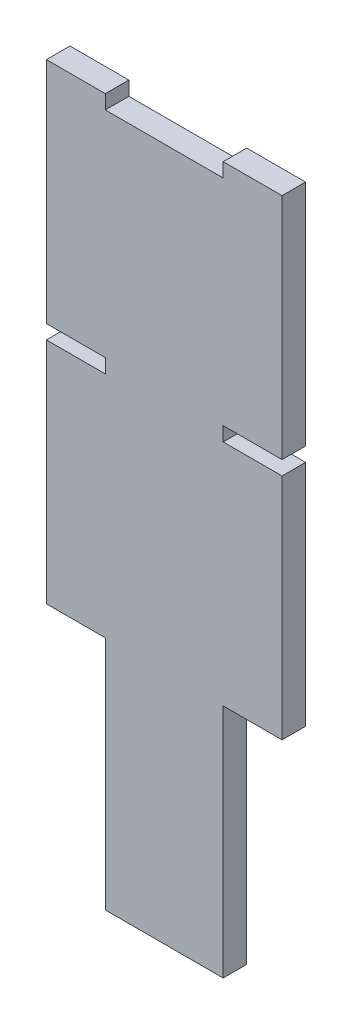
ISO-10303-21;
HEADER;
FILE_DESCRIPTION(('STEP AP214'),'2;1');
FILE_NAME('part.step','',(''),(''),'','','');
FILE_SCHEMA(('AUTOMOTIVE_DESIGN { 1 0 10303 214 1 1 1 1 }'));
ENDSEC;
DATA;
#1=APPLICATION_CONTEXT('core data for automotive mechanical design processes');
#2=APPLICATION_PROTOCOL_DEFINITION('international standard','automotive_design',2000,#1);
#3=PRODUCT_CONTEXT('',#1,'mechanical');
#4=PRODUCT('Part','Part','',(#3));
#5=PRODUCT_RELATED_PRODUCT_CATEGORY('part','',(#4));
#6=PRODUCT_DEFINITION_FORMATION('','',#4);
#7=PRODUCT_DEFINITION_CONTEXT('part definition',#1,'design');
#8=PRODUCT_DEFINITION('design','',#6,#7);
#9=PRODUCT_DEFINITION_SHAPE('','',#8);
#10=(LENGTH_UNIT() NAMED_UNIT(*) SI_UNIT(.MILLI.,.METRE.));
#11=(NAMED_UNIT(*) PLANE_ANGLE_UNIT() SI_UNIT($,.RADIAN.));
#12=(NAMED_UNIT(*) SI_UNIT($,.STERADIAN.) SOLID_ANGLE_UNIT());
#13=UNCERTAINTY_MEASURE_WITH_UNIT(LENGTH_MEASURE(1.E-05),#10,'distance_accuracy_value','');
#14=(GEOMETRIC_REPRESENTATION_CONTEXT(3) GLOBAL_UNCERTAINTY_ASSIGNED_CONTEXT((#13)) GLOBAL_UNIT_ASSIGNED_CONTEXT((#10,
#11,#12)) REPRESENTATION_CONTEXT('',''));
#15=CARTESIAN_POINT('',(0.,0.,0.));
#16=DIRECTION('',(0.,0.,1.));
#17=DIRECTION('',(1.,0.,0.));
#18=AXIS2_PLACEMENT_3D('',#15,#16,#17);
#19=CARTESIAN_POINT('',(25.,75.,5.));
#20=DIRECTION('',(-1.,0.,0.));
#21=DIRECTION('',(0.,-1.,0.));
#22=AXIS2_PLACEMENT_3D('',#19,#20,#21);
#23=PLANE('',#22);
#24=DIRECTION('',(0.,1.,0.));
#25=VECTOR('',#24,1.);
#26=CARTESIAN_POINT('',(25.,75.,5.));
#27=LINE('',#26,#25);
#28=CARTESIAN_POINT('',(25.,26.5,5.));
#29=VERTEX_POINT('',#28);
#30=CARTESIAN_POINT('',(25.,75.,5.));
#31=VERTEX_POINT('',#30);
#32=EDGE_CURVE('E207',#29,#31,#27,.T.);
#33=ORIENTED_EDGE('',*,*,#32,.F.);
#34=DIRECTION('',(0.,0.,1.));
#35=VECTOR('',#34,1.);
#36=CARTESIAN_POINT('',(25.,26.5,0.));
#37=LINE('',#36,#35);
#38=CARTESIAN_POINT('',(25.,26.5,0.));
#39=VERTEX_POINT('',#38);
#40=EDGE_CURVE('E274',#39,#29,#37,.T.);
#41=ORIENTED_EDGE('',*,*,#40,.F.);
#42=DIRECTION('',(0.,1.,0.));
#43=VECTOR('',#42,1.);
#44=CARTESIAN_POINT('',(25.,75.,0.));
#45=LINE('',#44,#43);
#46=CARTESIAN_POINT('',(25.,75.,0.));
#47=VERTEX_POINT('',#46);
#48=EDGE_CURVE('E201',#39,#47,#45,.T.);
#49=ORIENTED_EDGE('',*,*,#48,.T.);
#50=DIRECTION('',(0.,0.,-1.));
#51=VECTOR('',#50,1.);
#52=CARTESIAN_POINT('',(25.,75.,5.));
#53=LINE('',#52,#51);
#54=EDGE_CURVE('E11',#31,#47,#53,.T.);
#55=ORIENTED_EDGE('',*,*,#54,.F.);
#56=EDGE_LOOP('',(#33,#41,#49,#55));
#57=FACE_BOUND('',#56,.T.);
#58=ADVANCED_FACE('F33',(#57),#23,.F.);
#59=CARTESIAN_POINT('',(-25.,75.,5.));
#60=DIRECTION('',(0.,-1.,0.));
#61=DIRECTION('',(0.,0.,-1.));
#62=AXIS2_PLACEMENT_3D('',#59,#60,#61);
#63=PLANE('',#62);
#64=DIRECTION('',(-1.,0.,0.));
#65=VECTOR('',#64,1.);
#66=CARTESIAN_POINT('',(-25.,75.,0.));
#67=LINE('',#66,#65);
#68=CARTESIAN_POINT('',(12.5,75.,0.));
#69=VERTEX_POINT('',#68);
#70=EDGE_CURVE('E186',#47,#69,#67,.T.);
#71=ORIENTED_EDGE('',*,*,#70,.T.);
#72=DIRECTION('',(0.,0.,1.));
#73=VECTOR('',#72,1.);
#74=CARTESIAN_POINT('',(12.5,75.,0.));
#75=LINE('',#74,#73);
#76=CARTESIAN_POINT('',(12.5,75.,5.));
#77=VERTEX_POINT('',#76);
#78=EDGE_CURVE('E170',#69,#77,#75,.T.);
#79=ORIENTED_EDGE('',*,*,#78,.T.);
#80=DIRECTION('',(-1.,0.,0.));
#81=VECTOR('',#80,1.);
#82=CARTESIAN_POINT('',(-25.,75.,5.));
#83=LINE('',#82,#81);
#84=EDGE_CURVE('E224',#31,#77,#83,.T.);
#85=ORIENTED_EDGE('',*,*,#84,.F.);
#86=ORIENTED_EDGE('',*,*,#54,.T.);
#87=EDGE_LOOP('',(#71,#79,#85,#86));
#88=FACE_BOUND('',#87,.T.);
#89=ADVANCED_FACE('F191',(#88),#63,.F.);
#90=CARTESIAN_POINT('',(-25.,75.,5.));
#91=DIRECTION('',(1.,0.,0.));
#92=DIRECTION('',(0.,1.,0.));
#93=AXIS2_PLACEMENT_3D('',#90,#91,#92);
#94=PLANE('',#93);
#95=DIRECTION('',(0.,-1.,0.));
#96=VECTOR('',#95,1.);
#97=CARTESIAN_POINT('',(-25.,75.,0.));
#98=LINE('',#97,#96);
#99=CARTESIAN_POINT('',(-25.,75.,0.));
#100=VERTEX_POINT('',#99);
#101=CARTESIAN_POINT('',(-25.,26.5,0.));
#102=VERTEX_POINT('',#101);
#103=EDGE_CURVE('E197',#100,#102,#98,.T.);
#104=ORIENTED_EDGE('',*,*,#103,.T.);
#105=DIRECTION('',(0.,0.,1.));
#106=VECTOR('',#105,1.);
#107=CARTESIAN_POINT('',(-25.,26.5,0.));
#108=LINE('',#107,#106);
#109=CARTESIAN_POINT('',(-25.,26.5,5.));
#110=VERTEX_POINT('',#109);
#111=EDGE_CURVE('E299',#102,#110,#108,.T.);
#112=ORIENTED_EDGE('',*,*,#111,.T.);
#113=DIRECTION('',(0.,-1.,0.));
#114=VECTOR('',#113,1.);
#115=CARTESIAN_POINT('',(-25.,75.,5.));
#116=LINE('',#115,#114);
#117=CARTESIAN_POINT('',(-25.,75.,5.));
#118=VERTEX_POINT('',#117);
#119=EDGE_CURVE('E215',#118,#110,#116,.T.);
#120=ORIENTED_EDGE('',*,*,#119,.F.);
#121=DIRECTION('',(0.,0.,-1.));
#122=VECTOR('',#121,1.);
#123=CARTESIAN_POINT('',(-25.,75.,5.));
#124=LINE('',#123,#122);
#125=EDGE_CURVE('E41',#118,#100,#124,.T.);
#126=ORIENTED_EDGE('',*,*,#125,.T.);
#127=EDGE_LOOP('',(#104,#112,#120,#126));
#128=FACE_BOUND('',#127,.T.);
#129=ADVANCED_FACE('F374',(#128),#94,.F.);
#130=CARTESIAN_POINT('',(25.0000000000028,-25.,0.));
#131=VERTEX_POINT('',#130);
#132=CARTESIAN_POINT('',(25.,23.5,0.));
#133=VERTEX_POINT('',#132);
#134=EDGE_CURVE('E199',#131,#133,#45,.T.);
#135=ORIENTED_EDGE('',*,*,#134,.T.);
#136=DIRECTION('',(0.,0.,1.));
#137=VECTOR('',#136,1.);
#138=CARTESIAN_POINT('',(25.,23.5,0.));
#139=LINE('',#138,#137);
#140=CARTESIAN_POINT('',(25.,23.5,5.));
#141=VERTEX_POINT('',#140);
#142=EDGE_CURVE('E271',#133,#141,#139,.T.);
#143=ORIENTED_EDGE('',*,*,#142,.T.);
#144=CARTESIAN_POINT('',(25.0000000000028,-25.,5.));
#145=VERTEX_POINT('',#144);
#146=EDGE_CURVE('E228',#145,#141,#27,.T.);
#147=ORIENTED_EDGE('',*,*,#146,.F.);
#148=DIRECTION('',(0.,0.,1.));
#149=VECTOR('',#148,1.);
#150=CARTESIAN_POINT('',(25.0000000000028,-25.,0.));
#151=LINE('',#150,#149);
#152=EDGE_CURVE('E229',#131,#145,#151,.T.);
#153=ORIENTED_EDGE('',*,*,#152,.F.);
#154=EDGE_LOOP('',(#135,#143,#147,#153));
#155=FACE_BOUND('',#154,.T.);
#156=ADVANCED_FACE('F35',(#155),#23,.F.);
#157=CARTESIAN_POINT('',(-12.5,75.,5.));
#158=VERTEX_POINT('',#157);
#159=EDGE_CURVE('E226',#158,#118,#83,.T.);
#160=ORIENTED_EDGE('',*,*,#159,.F.);
#161=DIRECTION('',(0.,0.,1.));
#162=VECTOR('',#161,1.);
#163=CARTESIAN_POINT('',(-12.5,75.,0.));
#164=LINE('',#163,#162);
#165=CARTESIAN_POINT('',(-12.5,75.,0.));
#166=VERTEX_POINT('',#165);
#167=EDGE_CURVE('E180',#166,#158,#164,.T.);
#168=ORIENTED_EDGE('',*,*,#167,.F.);
#169=EDGE_CURVE('E194',#166,#100,#67,.T.);
#170=ORIENTED_EDGE('',*,*,#169,.T.);
#171=ORIENTED_EDGE('',*,*,#125,.F.);
#172=EDGE_LOOP('',(#160,#168,#170,#171));
#173=FACE_BOUND('',#172,.T.);
#174=ADVANCED_FACE('F334',(#173),#63,.F.);
#175=CARTESIAN_POINT('',(-25.,23.5,5.));
#176=VERTEX_POINT('',#175);
#177=CARTESIAN_POINT('',(-25.0000000000028,-25.,5.));
#178=VERTEX_POINT('',#177);
#179=EDGE_CURVE('E221',#176,#178,#116,.T.);
#180=ORIENTED_EDGE('',*,*,#179,.F.);
#181=DIRECTION('',(0.,0.,1.));
#182=VECTOR('',#181,1.);
#183=CARTESIAN_POINT('',(-25.,23.5,0.));
#184=LINE('',#183,#182);
#185=CARTESIAN_POINT('',(-25.,23.5,0.));
#186=VERTEX_POINT('',#185);
#187=EDGE_CURVE('E292',#186,#176,#184,.T.);
#188=ORIENTED_EDGE('',*,*,#187,.F.);
#189=CARTESIAN_POINT('',(-25.0000000000028,-25.,0.));
#190=VERTEX_POINT('',#189);
#191=EDGE_CURVE('E193',#186,#190,#98,.T.);
#192=ORIENTED_EDGE('',*,*,#191,.T.);
#193=DIRECTION('',(0.,0.,1.));
#194=VECTOR('',#193,1.);
#195=CARTESIAN_POINT('',(-25.0000000000028,-25.,0.));
#196=LINE('',#195,#194);
#197=EDGE_CURVE('E253',#190,#178,#196,.T.);
#198=ORIENTED_EDGE('',*,*,#197,.T.);
#199=EDGE_LOOP('',(#180,#188,#192,#198));
#200=FACE_BOUND('',#199,.T.);
#201=ADVANCED_FACE('F380',(#200),#94,.F.);
#202=CARTESIAN_POINT('',(-25.,-75.,5.));
#203=DIRECTION('',(0.,1.,0.));
#204=DIRECTION('',(0.,0.,1.));
#205=AXIS2_PLACEMENT_3D('',#202,#203,#204);
#206=PLANE('',#205);
#207=DIRECTION('',(1.,0.,0.));
#208=VECTOR('',#207,1.);
#209=CARTESIAN_POINT('',(-25.,-75.,5.));
#210=LINE('',#209,#208);
#211=CARTESIAN_POINT('',(-12.5,-75.,5.));
#212=VERTEX_POINT('',#211);
#213=CARTESIAN_POINT('',(12.5,-75.,5.));
#214=VERTEX_POINT('',#213);
#215=EDGE_CURVE('E209',#212,#214,#210,.T.);
#216=ORIENTED_EDGE('',*,*,#215,.F.);
#217=DIRECTION('',(0.,0.,1.));
#218=VECTOR('',#217,1.);
#219=CARTESIAN_POINT('',(-12.5,-75.,0.));
#220=LINE('',#219,#218);
#221=CARTESIAN_POINT('',(-12.5,-75.,0.));
#222=VERTEX_POINT('',#221);
#223=EDGE_CURVE('E248',#222,#212,#220,.T.);
#224=ORIENTED_EDGE('',*,*,#223,.F.);
#225=DIRECTION('',(1.,0.,0.));
#226=VECTOR('',#225,1.);
#227=CARTESIAN_POINT('',(-25.,-75.,0.));
#228=LINE('',#227,#226);
#229=CARTESIAN_POINT('',(12.5,-75.,0.));
#230=VERTEX_POINT('',#229);
#231=EDGE_CURVE('E205',#222,#230,#228,.T.);
#232=ORIENTED_EDGE('',*,*,#231,.T.);
#233=DIRECTION('',(0.,0.,1.));
#234=VECTOR('',#233,1.);
#235=CARTESIAN_POINT('',(12.5,-75.,0.));
#236=LINE('',#235,#234);
#237=EDGE_CURVE('E234',#230,#214,#236,.T.);
#238=ORIENTED_EDGE('',*,*,#237,.T.);
#239=EDGE_LOOP('',(#216,#224,#232,#238));
#240=FACE_BOUND('',#239,.T.);
#241=ADVANCED_FACE('F386',(#240),#206,.F.);
#242=CARTESIAN_POINT('',(0.,0.,5.));
#243=DIRECTION('',(0.,0.,1.));
#244=DIRECTION('',(1.,0.,0.));
#245=AXIS2_PLACEMENT_3D('',#242,#243,#244);
#246=PLANE('',#245);
#247=DIRECTION('',(0.,1.,0.));
#248=VECTOR('',#247,1.);
#249=CARTESIAN_POINT('',(12.5,75.,5.));
#250=LINE('',#249,#248);
#251=CARTESIAN_POINT('',(12.5,72.,5.));
#252=VERTEX_POINT('',#251);
#253=EDGE_CURVE('E175',#252,#77,#250,.T.);
#254=ORIENTED_EDGE('',*,*,#253,.F.);
#255=DIRECTION('',(1.,0.,0.));
#256=VECTOR('',#255,1.);
#257=CARTESIAN_POINT('',(-12.5,72.,5.));
#258=LINE('',#257,#256);
#259=CARTESIAN_POINT('',(-12.5,72.,5.));
#260=VERTEX_POINT('',#259);
#261=EDGE_CURVE('E189',#260,#252,#258,.T.);
#262=ORIENTED_EDGE('',*,*,#261,.F.);
#263=DIRECTION('',(0.,-1.,0.));
#264=VECTOR('',#263,1.);
#265=CARTESIAN_POINT('',(-12.5,75.,5.));
#266=LINE('',#265,#264);
#267=EDGE_CURVE('E322',#158,#260,#266,.T.);
#268=ORIENTED_EDGE('',*,*,#267,.F.);
#269=ORIENTED_EDGE('',*,*,#159,.T.);
#270=ORIENTED_EDGE('',*,*,#119,.T.);
#271=DIRECTION('',(-1.,0.,0.));
#272=VECTOR('',#271,1.);
#273=CARTESIAN_POINT('',(-25.,26.5,5.));
#274=LINE('',#273,#272);
#275=CARTESIAN_POINT('',(-12.5,26.5,5.));
#276=VERTEX_POINT('',#275);
#277=EDGE_CURVE('E302',#276,#110,#274,.T.);
#278=ORIENTED_EDGE('',*,*,#277,.F.);
#279=DIRECTION('',(0.,1.,0.));
#280=VECTOR('',#279,1.);
#281=CARTESIAN_POINT('',(-12.5,26.5,5.));
#282=LINE('',#281,#280);
#283=CARTESIAN_POINT('',(-12.5,23.5,5.));
#284=VERTEX_POINT('',#283);
#285=EDGE_CURVE('E305',#284,#276,#282,.T.);
#286=ORIENTED_EDGE('',*,*,#285,.F.);
#287=DIRECTION('',(1.,0.,0.));
#288=VECTOR('',#287,1.);
#289=CARTESIAN_POINT('',(-25.,23.5,5.));
#290=LINE('',#289,#288);
#291=EDGE_CURVE('E276',#176,#284,#290,.T.);
#292=ORIENTED_EDGE('',*,*,#291,.F.);
#293=ORIENTED_EDGE('',*,*,#179,.T.);
#294=DIRECTION('',(-1.,0.,0.));
#295=VECTOR('',#294,1.);
#296=CARTESIAN_POINT('',(-25.0000000000028,-25.,5.));
#297=LINE('',#296,#295);
#298=CARTESIAN_POINT('',(-12.5,-25.,5.));
#299=VERTEX_POINT('',#298);
#300=EDGE_CURVE('E257',#299,#178,#297,.T.);
#301=ORIENTED_EDGE('',*,*,#300,.F.);
#302=DIRECTION('',(0.,1.,0.));
#303=VECTOR('',#302,1.);
#304=CARTESIAN_POINT('',(-12.5,-25.,5.));
#305=LINE('',#304,#303);
#306=EDGE_CURVE('E237',#212,#299,#305,.T.);
#307=ORIENTED_EDGE('',*,*,#306,.F.);
#308=ORIENTED_EDGE('',*,*,#215,.T.);
#309=DIRECTION('',(0.,-1.,0.));
#310=VECTOR('',#309,1.);
#311=CARTESIAN_POINT('',(12.5,-25.,5.));
#312=LINE('',#311,#310);
#313=CARTESIAN_POINT('',(12.5,-25.,5.));
#314=VERTEX_POINT('',#313);
#315=EDGE_CURVE('E238',#314,#214,#312,.T.);
#316=ORIENTED_EDGE('',*,*,#315,.F.);
#317=DIRECTION('',(-1.,0.,0.));
#318=VECTOR('',#317,1.);
#319=CARTESIAN_POINT('',(25.0000000000028,-25.,5.));
#320=LINE('',#319,#318);
#321=EDGE_CURVE('E241',#145,#314,#320,.T.);
#322=ORIENTED_EDGE('',*,*,#321,.F.);
#323=ORIENTED_EDGE('',*,*,#146,.T.);
#324=DIRECTION('',(1.,0.,0.));
#325=VECTOR('',#324,1.);
#326=CARTESIAN_POINT('',(25.,23.5,5.));
#327=LINE('',#326,#325);
#328=CARTESIAN_POINT('',(12.5,23.5,5.));
#329=VERTEX_POINT('',#328);
#330=EDGE_CURVE('E277',#329,#141,#327,.T.);
#331=ORIENTED_EDGE('',*,*,#330,.F.);
#332=DIRECTION('',(0.,-1.,0.));
#333=VECTOR('',#332,1.);
#334=CARTESIAN_POINT('',(12.5,26.5,5.));
#335=LINE('',#334,#333);
#336=CARTESIAN_POINT('',(12.5,26.5,5.));
#337=VERTEX_POINT('',#336);
#338=EDGE_CURVE('E280',#337,#329,#335,.T.);
#339=ORIENTED_EDGE('',*,*,#338,.F.);
#340=DIRECTION('',(-1.,0.,0.));
#341=VECTOR('',#340,1.);
#342=CARTESIAN_POINT('',(25.,26.5,5.));
#343=LINE('',#342,#341);
#344=EDGE_CURVE('E256',#29,#337,#343,.T.);
#345=ORIENTED_EDGE('',*,*,#344,.F.);
#346=ORIENTED_EDGE('',*,*,#32,.T.);
#347=ORIENTED_EDGE('',*,*,#84,.T.);
#348=EDGE_LOOP('',(#254,#262,#268,#269,#270,#278,#286,#292,#293,#301,#307,#308,#316,#322,#323,
#331,#339,#345,#346,#347));
#349=FACE_BOUND('',#348,.T.);
#350=ADVANCED_FACE('F339',(#349),#246,.T.);
#351=CARTESIAN_POINT('',(0.,0.,0.));
#352=DIRECTION('',(0.,0.,1.));
#353=DIRECTION('',(1.,0.,0.));
#354=AXIS2_PLACEMENT_3D('',#351,#352,#353);
#355=PLANE('',#354);
#356=DIRECTION('',(1.,0.,0.));
#357=VECTOR('',#356,1.);
#358=CARTESIAN_POINT('',(-12.5,72.,0.));
#359=LINE('',#358,#357);
#360=CARTESIAN_POINT('',(-12.5,72.,0.));
#361=VERTEX_POINT('',#360);
#362=CARTESIAN_POINT('',(12.5,72.,0.));
#363=VERTEX_POINT('',#362);
#364=EDGE_CURVE('E48',#361,#363,#359,.T.);
#365=ORIENTED_EDGE('',*,*,#364,.T.);
#366=DIRECTION('',(0.,1.,0.));
#367=VECTOR('',#366,1.);
#368=CARTESIAN_POINT('',(12.5,75.,0.));
#369=LINE('',#368,#367);
#370=EDGE_CURVE('E173',#363,#69,#369,.T.);
#371=ORIENTED_EDGE('',*,*,#370,.T.);
#372=ORIENTED_EDGE('',*,*,#70,.F.);
#373=ORIENTED_EDGE('',*,*,#48,.F.);
#374=DIRECTION('',(-1.,0.,0.));
#375=VECTOR('',#374,1.);
#376=CARTESIAN_POINT('',(25.,26.5,0.));
#377=LINE('',#376,#375);
#378=CARTESIAN_POINT('',(12.5,26.5,0.));
#379=VERTEX_POINT('',#378);
#380=EDGE_CURVE('E279',#39,#379,#377,.T.);
#381=ORIENTED_EDGE('',*,*,#380,.T.);
#382=DIRECTION('',(0.,-1.,0.));
#383=VECTOR('',#382,1.);
#384=CARTESIAN_POINT('',(12.5,26.5,0.));
#385=LINE('',#384,#383);
#386=CARTESIAN_POINT('',(12.5,23.5,0.));
#387=VERTEX_POINT('',#386);
#388=EDGE_CURVE('E287',#379,#387,#385,.T.);
#389=ORIENTED_EDGE('',*,*,#388,.T.);
#390=DIRECTION('',(1.,0.,0.));
#391=VECTOR('',#390,1.);
#392=CARTESIAN_POINT('',(25.,23.5,0.));
#393=LINE('',#392,#391);
#394=EDGE_CURVE('E269',#387,#133,#393,.T.);
#395=ORIENTED_EDGE('',*,*,#394,.T.);
#396=ORIENTED_EDGE('',*,*,#134,.F.);
#397=DIRECTION('',(-1.,0.,0.));
#398=VECTOR('',#397,1.);
#399=CARTESIAN_POINT('',(25.0000000000028,-25.,0.));
#400=LINE('',#399,#398);
#401=CARTESIAN_POINT('',(12.5,-25.,0.));
#402=VERTEX_POINT('',#401);
#403=EDGE_CURVE('E240',#131,#402,#400,.T.);
#404=ORIENTED_EDGE('',*,*,#403,.T.);
#405=DIRECTION('',(0.,-1.,0.));
#406=VECTOR('',#405,1.);
#407=CARTESIAN_POINT('',(12.5,-25.,0.));
#408=LINE('',#407,#406);
#409=EDGE_CURVE('E232',#402,#230,#408,.T.);
#410=ORIENTED_EDGE('',*,*,#409,.T.);
#411=ORIENTED_EDGE('',*,*,#231,.F.);
#412=DIRECTION('',(0.,1.,0.));
#413=VECTOR('',#412,1.);
#414=CARTESIAN_POINT('',(-12.5,-25.,0.));
#415=LINE('',#414,#413);
#416=CARTESIAN_POINT('',(-12.5,-25.,0.));
#417=VERTEX_POINT('',#416);
#418=EDGE_CURVE('E259',#222,#417,#415,.T.);
#419=ORIENTED_EDGE('',*,*,#418,.T.);
#420=DIRECTION('',(-1.,0.,0.));
#421=VECTOR('',#420,1.);
#422=CARTESIAN_POINT('',(-25.0000000000028,-25.,0.));
#423=LINE('',#422,#421);
#424=EDGE_CURVE('E251',#417,#190,#423,.T.);
#425=ORIENTED_EDGE('',*,*,#424,.T.);
#426=ORIENTED_EDGE('',*,*,#191,.F.);
#427=DIRECTION('',(1.,0.,0.));
#428=VECTOR('',#427,1.);
#429=CARTESIAN_POINT('',(-25.,23.5,0.));
#430=LINE('',#429,#428);
#431=CARTESIAN_POINT('',(-12.5,23.5,0.));
#432=VERTEX_POINT('',#431);
#433=EDGE_CURVE('E304',#186,#432,#430,.T.);
#434=ORIENTED_EDGE('',*,*,#433,.T.);
#435=DIRECTION('',(0.,1.,0.));
#436=VECTOR('',#435,1.);
#437=CARTESIAN_POINT('',(-12.5,26.5,0.));
#438=LINE('',#437,#436);
#439=CARTESIAN_POINT('',(-12.5,26.5,0.));
#440=VERTEX_POINT('',#439);
#441=EDGE_CURVE('E56',#432,#440,#438,.T.);
#442=ORIENTED_EDGE('',*,*,#441,.T.);
#443=DIRECTION('',(-1.,0.,0.));
#444=VECTOR('',#443,1.);
#445=CARTESIAN_POINT('',(-25.,26.5,0.));
#446=LINE('',#445,#444);
#447=EDGE_CURVE('E295',#440,#102,#446,.T.);
#448=ORIENTED_EDGE('',*,*,#447,.T.);
#449=ORIENTED_EDGE('',*,*,#103,.F.);
#450=ORIENTED_EDGE('',*,*,#169,.F.);
#451=DIRECTION('',(0.,-1.,0.));
#452=VECTOR('',#451,1.);
#453=CARTESIAN_POINT('',(-12.5,75.,0.));
#454=LINE('',#453,#452);
#455=EDGE_CURVE('E188',#166,#361,#454,.T.);
#456=ORIENTED_EDGE('',*,*,#455,.T.);
#457=EDGE_LOOP('',(#365,#371,#372,#373,#381,#389,#395,#396,#404,#410,#411,#419,#425,#426,#434,
#442,#448,#449,#450,#456));
#458=FACE_BOUND('',#457,.T.);
#459=ADVANCED_FACE('F184',(#458),#355,.F.);
#460=CARTESIAN_POINT('',(12.5,-25.,0.));
#461=DIRECTION('',(-1.,0.,0.));
#462=DIRECTION('',(0.,-1.,0.));
#463=AXIS2_PLACEMENT_3D('',#460,#461,#462);
#464=PLANE('',#463);
#465=ORIENTED_EDGE('',*,*,#315,.T.);
#466=ORIENTED_EDGE('',*,*,#237,.F.);
#467=ORIENTED_EDGE('',*,*,#409,.F.);
#468=DIRECTION('',(0.,0.,1.));
#469=VECTOR('',#468,1.);
#470=CARTESIAN_POINT('',(12.5,-25.,0.));
#471=LINE('',#470,#469);
#472=EDGE_CURVE('E231',#402,#314,#471,.T.);
#473=ORIENTED_EDGE('',*,*,#472,.T.);
#474=EDGE_LOOP('',(#465,#466,#467,#473));
#475=FACE_BOUND('',#474,.T.);
#476=ADVANCED_FACE('F407',(#475),#464,.F.);
#477=CARTESIAN_POINT('',(25.0000000000028,-25.,0.));
#478=DIRECTION('',(0.,1.,0.));
#479=DIRECTION('',(0.,0.,1.));
#480=AXIS2_PLACEMENT_3D('',#477,#478,#479);
#481=PLANE('',#480);
#482=ORIENTED_EDGE('',*,*,#321,.T.);
#483=ORIENTED_EDGE('',*,*,#472,.F.);
#484=ORIENTED_EDGE('',*,*,#403,.F.);
#485=ORIENTED_EDGE('',*,*,#152,.T.);
#486=EDGE_LOOP('',(#482,#483,#484,#485));
#487=FACE_BOUND('',#486,.T.);
#488=ADVANCED_FACE('F410',(#487),#481,.F.);
#489=CARTESIAN_POINT('',(-25.0000000000028,-25.,0.));
#490=DIRECTION('',(0.,1.,0.));
#491=DIRECTION('',(0.,0.,1.));
#492=AXIS2_PLACEMENT_3D('',#489,#490,#491);
#493=PLANE('',#492);
#494=ORIENTED_EDGE('',*,*,#300,.T.);
#495=ORIENTED_EDGE('',*,*,#197,.F.);
#496=ORIENTED_EDGE('',*,*,#424,.F.);
#497=DIRECTION('',(0.,0.,1.));
#498=VECTOR('',#497,1.);
#499=CARTESIAN_POINT('',(-12.5,-25.,0.));
#500=LINE('',#499,#498);
#501=EDGE_CURVE('E250',#417,#299,#500,.T.);
#502=ORIENTED_EDGE('',*,*,#501,.T.);
#503=EDGE_LOOP('',(#494,#495,#496,#502));
#504=FACE_BOUND('',#503,.T.);
#505=ADVANCED_FACE('F365',(#504),#493,.F.);
#506=CARTESIAN_POINT('',(-12.5,-25.,0.));
#507=DIRECTION('',(1.,0.,0.));
#508=DIRECTION('',(0.,1.,0.));
#509=AXIS2_PLACEMENT_3D('',#506,#507,#508);
#510=PLANE('',#509);
#511=ORIENTED_EDGE('',*,*,#306,.T.);
#512=ORIENTED_EDGE('',*,*,#501,.F.);
#513=ORIENTED_EDGE('',*,*,#418,.F.);
#514=ORIENTED_EDGE('',*,*,#223,.T.);
#515=EDGE_LOOP('',(#511,#512,#513,#514));
#516=FACE_BOUND('',#515,.T.);
#517=ADVANCED_FACE('F358',(#516),#510,.F.);
#518=CARTESIAN_POINT('',(25.,26.5,0.));
#519=DIRECTION('',(0.,1.,0.));
#520=DIRECTION('',(0.,0.,1.));
#521=AXIS2_PLACEMENT_3D('',#518,#519,#520);
#522=PLANE('',#521);
#523=ORIENTED_EDGE('',*,*,#344,.T.);
#524=DIRECTION('',(0.,0.,1.));
#525=VECTOR('',#524,1.);
#526=CARTESIAN_POINT('',(12.5,26.5,0.));
#527=LINE('',#526,#525);
#528=EDGE_CURVE('E266',#379,#337,#527,.T.);
#529=ORIENTED_EDGE('',*,*,#528,.F.);
#530=ORIENTED_EDGE('',*,*,#380,.F.);
#531=ORIENTED_EDGE('',*,*,#40,.T.);
#532=EDGE_LOOP('',(#523,#529,#530,#531));
#533=FACE_BOUND('',#532,.T.);
#534=ADVANCED_FACE('F356',(#533),#522,.F.);
#535=CARTESIAN_POINT('',(25.,23.5,0.));
#536=DIRECTION('',(0.,-1.,0.));
#537=DIRECTION('',(0.,0.,-1.));
#538=AXIS2_PLACEMENT_3D('',#535,#536,#537);
#539=PLANE('',#538);
#540=ORIENTED_EDGE('',*,*,#330,.T.);
#541=ORIENTED_EDGE('',*,*,#142,.F.);
#542=ORIENTED_EDGE('',*,*,#394,.F.);
#543=DIRECTION('',(0.,0.,1.));
#544=VECTOR('',#543,1.);
#545=CARTESIAN_POINT('',(12.5,23.5,0.));
#546=LINE('',#545,#544);
#547=EDGE_CURVE('E268',#387,#329,#546,.T.);
#548=ORIENTED_EDGE('',*,*,#547,.T.);
#549=EDGE_LOOP('',(#540,#541,#542,#548));
#550=FACE_BOUND('',#549,.T.);
#551=ADVANCED_FACE('F346',(#550),#539,.F.);
#552=CARTESIAN_POINT('',(12.5,26.5,0.));
#553=DIRECTION('',(-1.,0.,0.));
#554=DIRECTION('',(0.,0.,1.));
#555=AXIS2_PLACEMENT_3D('',#552,#553,#554);
#556=PLANE('',#555);
#557=ORIENTED_EDGE('',*,*,#338,.T.);
#558=ORIENTED_EDGE('',*,*,#547,.F.);
#559=ORIENTED_EDGE('',*,*,#388,.F.);
#560=ORIENTED_EDGE('',*,*,#528,.T.);
#561=EDGE_LOOP('',(#557,#558,#559,#560));
#562=FACE_BOUND('',#561,.T.);
#563=ADVANCED_FACE('F350',(#562),#556,.F.);
#564=CARTESIAN_POINT('',(-25.,26.5,0.));
#565=DIRECTION('',(0.,1.,0.));
#566=DIRECTION('',(-1.,0.,0.));
#567=AXIS2_PLACEMENT_3D('',#564,#565,#566);
#568=PLANE('',#567);
#569=ORIENTED_EDGE('',*,*,#277,.T.);
#570=ORIENTED_EDGE('',*,*,#111,.F.);
#571=ORIENTED_EDGE('',*,*,#447,.F.);
#572=DIRECTION('',(0.,0.,1.));
#573=VECTOR('',#572,1.);
#574=CARTESIAN_POINT('',(-12.5,26.5,0.));
#575=LINE('',#574,#573);
#576=EDGE_CURVE('E297',#440,#276,#575,.T.);
#577=ORIENTED_EDGE('',*,*,#576,.T.);
#578=EDGE_LOOP('',(#569,#570,#571,#577));
#579=FACE_BOUND('',#578,.T.);
#580=ADVANCED_FACE('F466',(#579),#568,.F.);
#581=CARTESIAN_POINT('',(-12.5,26.5,0.));
#582=DIRECTION('',(1.,0.,0.));
#583=DIRECTION('',(0.,0.,-1.));
#584=AXIS2_PLACEMENT_3D('',#581,#582,#583);
#585=PLANE('',#584);
#586=ORIENTED_EDGE('',*,*,#285,.T.);
#587=ORIENTED_EDGE('',*,*,#576,.F.);
#588=ORIENTED_EDGE('',*,*,#441,.F.);
#589=DIRECTION('',(0.,0.,1.));
#590=VECTOR('',#589,1.);
#591=CARTESIAN_POINT('',(-12.5,23.5,0.));
#592=LINE('',#591,#590);
#593=EDGE_CURVE('E294',#432,#284,#592,.T.);
#594=ORIENTED_EDGE('',*,*,#593,.T.);
#595=EDGE_LOOP('',(#586,#587,#588,#594));
#596=FACE_BOUND('',#595,.T.);
#597=ADVANCED_FACE('F474',(#596),#585,.F.);
#598=CARTESIAN_POINT('',(-25.,23.5,0.));
#599=DIRECTION('',(0.,-1.,0.));
#600=DIRECTION('',(0.,0.,-1.));
#601=AXIS2_PLACEMENT_3D('',#598,#599,#600);
#602=PLANE('',#601);
#603=ORIENTED_EDGE('',*,*,#291,.T.);
#604=ORIENTED_EDGE('',*,*,#593,.F.);
#605=ORIENTED_EDGE('',*,*,#433,.F.);
#606=ORIENTED_EDGE('',*,*,#187,.T.);
#607=EDGE_LOOP('',(#603,#604,#605,#606));
#608=FACE_BOUND('',#607,.T.);
#609=ADVANCED_FACE('F401',(#608),#602,.F.);
#610=CARTESIAN_POINT('',(12.5,75.,0.));
#611=DIRECTION('',(1.,0.,0.));
#612=DIRECTION('',(0.,0.,-1.));
#613=AXIS2_PLACEMENT_3D('',#610,#611,#612);
#614=PLANE('',#613);
#615=ORIENTED_EDGE('',*,*,#253,.T.);
#616=ORIENTED_EDGE('',*,*,#78,.F.);
#617=ORIENTED_EDGE('',*,*,#370,.F.);
#618=DIRECTION('',(0.,0.,1.));
#619=VECTOR('',#618,1.);
#620=CARTESIAN_POINT('',(12.5,72.,0.));
#621=LINE('',#620,#619);
#622=EDGE_CURVE('E318',#363,#252,#621,.T.);
#623=ORIENTED_EDGE('',*,*,#622,.T.);
#624=EDGE_LOOP('',(#615,#616,#617,#623));
#625=FACE_BOUND('',#624,.T.);
#626=ADVANCED_FACE('F172',(#625),#614,.F.);
#627=CARTESIAN_POINT('',(-12.5,72.,0.));
#628=DIRECTION('',(0.,-1.,0.));
#629=DIRECTION('',(0.,0.,-1.));
#630=AXIS2_PLACEMENT_3D('',#627,#628,#629);
#631=PLANE('',#630);
#632=ORIENTED_EDGE('',*,*,#261,.T.);
#633=ORIENTED_EDGE('',*,*,#622,.F.);
#634=ORIENTED_EDGE('',*,*,#364,.F.);
#635=DIRECTION('',(0.,0.,1.));
#636=VECTOR('',#635,1.);
#637=CARTESIAN_POINT('',(-12.5,72.,0.));
#638=LINE('',#637,#636);
#639=EDGE_CURVE('E316',#361,#260,#638,.T.);
#640=ORIENTED_EDGE('',*,*,#639,.T.);
#641=EDGE_LOOP('',(#632,#633,#634,#640));
#642=FACE_BOUND('',#641,.T.);
#643=ADVANCED_FACE('F500',(#642),#631,.F.);
#644=CARTESIAN_POINT('',(-12.5,75.,0.));
#645=DIRECTION('',(-1.,0.,0.));
#646=DIRECTION('',(0.,-1.,0.));
#647=AXIS2_PLACEMENT_3D('',#644,#645,#646);
#648=PLANE('',#647);
#649=ORIENTED_EDGE('',*,*,#267,.T.);
#650=ORIENTED_EDGE('',*,*,#639,.F.);
#651=ORIENTED_EDGE('',*,*,#455,.F.);
#652=ORIENTED_EDGE('',*,*,#167,.T.);
#653=EDGE_LOOP('',(#649,#650,#651,#652));
#654=FACE_BOUND('',#653,.T.);
#655=ADVANCED_FACE('F330',(#654),#648,.F.);
#656=CLOSED_SHELL('',(#58,#89,#129,#156,#174,#201,#241,#350,#459,#476,#488,#505,#517,#534,#551,
#563,#580,#597,#609,#626,#643,#655));
#657=MANIFOLD_SOLID_BREP('B2',#656);
#658=ADVANCED_BREP_SHAPE_REPRESENTATION('',(#18,#657),#14);
#659=SHAPE_DEFINITION_REPRESENTATION(#9,#658);
ENDSEC;
END-ISO-10303-21;
